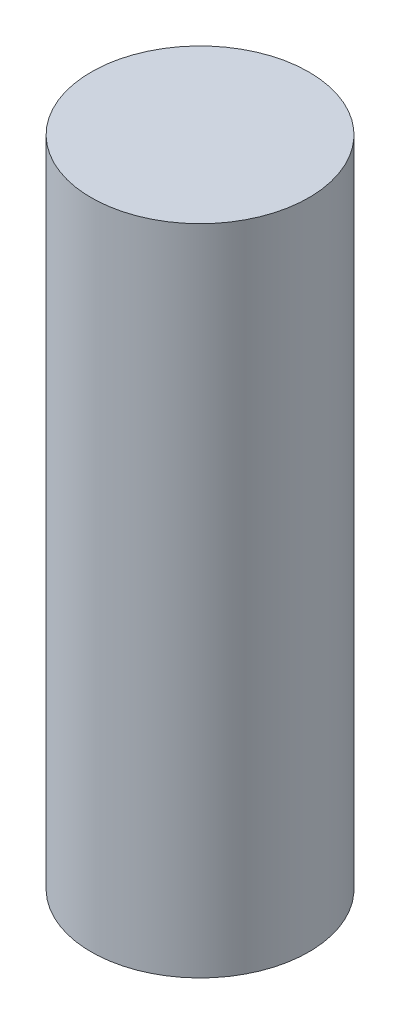
ISO-10303-21;
HEADER;
FILE_DESCRIPTION(('STEP AP214'),'2;1');
FILE_NAME('part.step','',(''),(''),'','','');
FILE_SCHEMA(('AUTOMOTIVE_DESIGN { 1 0 10303 214 1 1 1 1 }'));
ENDSEC;
DATA;
#1=APPLICATION_CONTEXT('core data for automotive mechanical design processes');
#2=APPLICATION_PROTOCOL_DEFINITION('international standard','automotive_design',2000,#1);
#3=PRODUCT_CONTEXT('',#1,'mechanical');
#4=PRODUCT('Part','Part','',(#3));
#5=PRODUCT_RELATED_PRODUCT_CATEGORY('part','',(#4));
#6=PRODUCT_DEFINITION_FORMATION('','',#4);
#7=PRODUCT_DEFINITION_CONTEXT('part definition',#1,'design');
#8=PRODUCT_DEFINITION('design','',#6,#7);
#9=PRODUCT_DEFINITION_SHAPE('','',#8);
#10=(LENGTH_UNIT() NAMED_UNIT(*) SI_UNIT(.MILLI.,.METRE.));
#11=(NAMED_UNIT(*) PLANE_ANGLE_UNIT() SI_UNIT($,.RADIAN.));
#12=(NAMED_UNIT(*) SI_UNIT($,.STERADIAN.) SOLID_ANGLE_UNIT());
#13=UNCERTAINTY_MEASURE_WITH_UNIT(LENGTH_MEASURE(1.E-05),#10,'distance_accuracy_value','');
#14=(GEOMETRIC_REPRESENTATION_CONTEXT(3) GLOBAL_UNCERTAINTY_ASSIGNED_CONTEXT((#13)) GLOBAL_UNIT_ASSIGNED_CONTEXT((#10,
#11,#12)) REPRESENTATION_CONTEXT('',''));
#15=CARTESIAN_POINT('',(0.,0.,0.));
#16=DIRECTION('',(0.,0.,1.));
#17=DIRECTION('',(1.,0.,0.));
#18=AXIS2_PLACEMENT_3D('',#15,#16,#17);
#19=CARTESIAN_POINT('',(0.,9.525,0.));
#20=DIRECTION('',(0.,-1.,0.));
#21=DIRECTION('',(0.,0.,-1.));
#22=AXIS2_PLACEMENT_3D('',#19,#20,#21);
#23=CYLINDRICAL_SURFACE('',#22,1.5875);
#24=CARTESIAN_POINT('',(0.,9.525,0.));
#25=DIRECTION('',(0.,1.,0.));
#26=DIRECTION('',(0.,0.,1.));
#27=AXIS2_PLACEMENT_3D('',#24,#25,#26);
#28=CIRCLE('',#27,1.5875);
#29=CARTESIAN_POINT('',(0.,9.525,-1.5875));
#30=VERTEX_POINT('',#29);
#31=EDGE_CURVE('E10',#30,#30,#28,.T.);
#32=CARTESIAN_POINT('',(0.,0.,0.));
#33=DIRECTION('',(0.,1.,0.));
#34=DIRECTION('',(0.,0.,1.));
#35=AXIS2_PLACEMENT_3D('',#32,#33,#34);
#36=CIRCLE('',#35,1.5875);
#37=CARTESIAN_POINT('',(0.,0.,-1.5875));
#38=VERTEX_POINT('',#37);
#39=EDGE_CURVE('E34',#38,#38,#36,.T.);
#40=CARTESIAN_POINT('',(0.,9.525,-1.5875));
#41=CARTESIAN_POINT('',(0.,9.42578125,-1.5875));
#42=CARTESIAN_POINT('',(0.,9.3265625,-1.5875));
#43=CARTESIAN_POINT('',(0.,9.128125,-1.5875));
#44=CARTESIAN_POINT('',(0.,9.02890625,-1.5875));
#45=CARTESIAN_POINT('',(0.,8.83046875,-1.5875));
#46=CARTESIAN_POINT('',(0.,8.73125,-1.5875));
#47=CARTESIAN_POINT('',(0.,8.5328125,-1.5875));
#48=CARTESIAN_POINT('',(0.,8.43359375,-1.5875));
#49=CARTESIAN_POINT('',(0.,8.23515625,-1.5875));
#50=CARTESIAN_POINT('',(0.,8.1359375,-1.5875));
#51=CARTESIAN_POINT('',(0.,7.9375,-1.5875));
#52=CARTESIAN_POINT('',(0.,7.83828125,-1.5875));
#53=CARTESIAN_POINT('',(0.,7.63984375,-1.5875));
#54=CARTESIAN_POINT('',(0.,7.540625,-1.5875));
#55=CARTESIAN_POINT('',(0.,7.3421875,-1.5875));
#56=CARTESIAN_POINT('',(0.,7.24296875,-1.5875));
#57=CARTESIAN_POINT('',(0.,7.04453125,-1.5875));
#58=CARTESIAN_POINT('',(0.,6.9453125,-1.5875));
#59=CARTESIAN_POINT('',(0.,6.746875,-1.5875));
#60=CARTESIAN_POINT('',(0.,6.64765625,-1.5875));
#61=CARTESIAN_POINT('',(0.,6.44921875,-1.5875));
#62=CARTESIAN_POINT('',(0.,6.35,-1.5875));
#63=CARTESIAN_POINT('',(0.,6.1515625,-1.5875));
#64=CARTESIAN_POINT('',(0.,6.05234375,-1.5875));
#65=CARTESIAN_POINT('',(0.,5.85390625,-1.5875));
#66=CARTESIAN_POINT('',(0.,5.7546875,-1.5875));
#67=CARTESIAN_POINT('',(0.,5.55625,-1.5875));
#68=CARTESIAN_POINT('',(0.,5.45703125,-1.5875));
#69=CARTESIAN_POINT('',(0.,5.25859375,-1.5875));
#70=CARTESIAN_POINT('',(0.,5.159375,-1.5875));
#71=CARTESIAN_POINT('',(0.,4.9609375,-1.5875));
#72=CARTESIAN_POINT('',(0.,4.86171875,-1.5875));
#73=CARTESIAN_POINT('',(0.,4.66328125,-1.5875));
#74=CARTESIAN_POINT('',(0.,4.5640625,-1.5875));
#75=CARTESIAN_POINT('',(0.,4.365625,-1.5875));
#76=CARTESIAN_POINT('',(0.,4.26640625,-1.5875));
#77=CARTESIAN_POINT('',(0.,4.06796875,-1.5875));
#78=CARTESIAN_POINT('',(0.,3.96875,-1.5875));
#79=CARTESIAN_POINT('',(0.,3.7703125,-1.5875));
#80=CARTESIAN_POINT('',(0.,3.67109375,-1.5875));
#81=CARTESIAN_POINT('',(0.,3.47265625,-1.5875));
#82=CARTESIAN_POINT('',(0.,3.3734375,-1.5875));
#83=CARTESIAN_POINT('',(0.,3.175,-1.5875));
#84=CARTESIAN_POINT('',(0.,3.07578125,-1.5875));
#85=CARTESIAN_POINT('',(0.,2.87734375,-1.5875));
#86=CARTESIAN_POINT('',(0.,2.778125,-1.5875));
#87=CARTESIAN_POINT('',(0.,2.5796875,-1.5875));
#88=CARTESIAN_POINT('',(0.,2.48046875,-1.5875));
#89=CARTESIAN_POINT('',(0.,2.28203125,-1.5875));
#90=CARTESIAN_POINT('',(0.,2.1828125,-1.5875));
#91=CARTESIAN_POINT('',(0.,1.984375,-1.5875));
#92=CARTESIAN_POINT('',(0.,1.88515625,-1.5875));
#93=CARTESIAN_POINT('',(0.,1.68671875,-1.5875));
#94=CARTESIAN_POINT('',(0.,1.5875,-1.5875));
#95=CARTESIAN_POINT('',(0.,1.3890625,-1.5875));
#96=CARTESIAN_POINT('',(0.,1.28984375,-1.5875));
#97=CARTESIAN_POINT('',(0.,1.09140625,-1.5875));
#98=CARTESIAN_POINT('',(0.,0.992187500000001,-1.5875));
#99=CARTESIAN_POINT('',(0.,0.793750000000001,-1.5875));
#100=CARTESIAN_POINT('',(0.,0.69453125,-1.5875));
#101=CARTESIAN_POINT('',(0.,0.49609375,-1.5875));
#102=CARTESIAN_POINT('',(0.,0.396875,-1.5875));
#103=CARTESIAN_POINT('',(0.,0.1984375,-1.5875));
#104=CARTESIAN_POINT('',(0.,0.0992187500000001,-1.5875));
#105=CARTESIAN_POINT('',(0.,0.,-1.5875));
#106=B_SPLINE_CURVE_WITH_KNOTS('',3,(#40,#41,#42,#43,#44,#45,#46,#47,#48,#49,#50,#51,#52,#53,
#54,#55,#56,#57,#58,#59,#60,#61,#62,#63,#64,#65,#66,#67,#68,#69,#70,#71,#72,#73,#74,#75,#76,#77,
#78,#79,#80,#81,#82,#83,#84,#85,#86,#87,#88,#89,#90,#91,#92,#93,#94,#95,#96,#97,#98,#99,#100,
#101,#102,#103,#104,#105),.UNSPECIFIED.,.F.,.F.,(4,2,2,2,2,2,2,2,2,2,2,2,2,2,2,2,2,2,2,2,2,2,2,
2,2,2,2,2,2,2,2,2,4),(0.,0.297656249999998,0.595312499999999,0.892968749999999,1.190625,
1.48828125,1.7859375,2.08359375,2.38125,2.67890625,2.9765625,3.27421875,3.571875,3.86953125,
4.1671875,4.46484375,4.7625,5.06015625,5.3578125,5.65546875,5.953125,6.25078125,6.5484375,
6.84609375,7.14375,7.44140625,7.7390625,8.03671875,8.334375,8.63203125,8.9296875,9.22734375,
9.525),.UNSPECIFIED.);
#107=EDGE_CURVE('BSEAM31',#30,#38,#106,.T.);
#108=ORIENTED_EDGE('',*,*,#31,.F.);
#109=ORIENTED_EDGE('',*,*,#39,.T.);
#110=ORIENTED_EDGE('',*,*,#107,.T.);
#111=ORIENTED_EDGE('',*,*,#107,.F.);
#112=EDGE_LOOP('',(#108,#110,#109,#111));
#113=FACE_BOUND('',#112,.T.);
#114=ADVANCED_FACE('F31',(#113),#23,.T.);
#115=CARTESIAN_POINT('',(0.,9.525,0.));
#116=DIRECTION('',(0.,1.,0.));
#117=DIRECTION('',(0.,0.,1.));
#118=AXIS2_PLACEMENT_3D('',#115,#116,#117);
#119=PLANE('',#118);
#120=ORIENTED_EDGE('',*,*,#31,.T.);
#121=EDGE_LOOP('',(#120));
#122=FACE_BOUND('',#121,.T.);
#123=ADVANCED_FACE('F46',(#122),#119,.T.);
#124=CARTESIAN_POINT('',(0.,0.,0.));
#125=DIRECTION('',(0.,1.,0.));
#126=DIRECTION('',(0.,0.,1.));
#127=AXIS2_PLACEMENT_3D('',#124,#125,#126);
#128=PLANE('',#127);
#129=ORIENTED_EDGE('',*,*,#39,.F.);
#130=EDGE_LOOP('',(#129));
#131=FACE_BOUND('',#130,.T.);
#132=ADVANCED_FACE('F44',(#131),#128,.F.);
#133=CLOSED_SHELL('',(#114,#123,#132));
#134=MANIFOLD_SOLID_BREP('B2',#133);
#135=ADVANCED_BREP_SHAPE_REPRESENTATION('',(#18,#134),#14);
#136=SHAPE_DEFINITION_REPRESENTATION(#9,#135);
ENDSEC;
END-ISO-10303-21;
